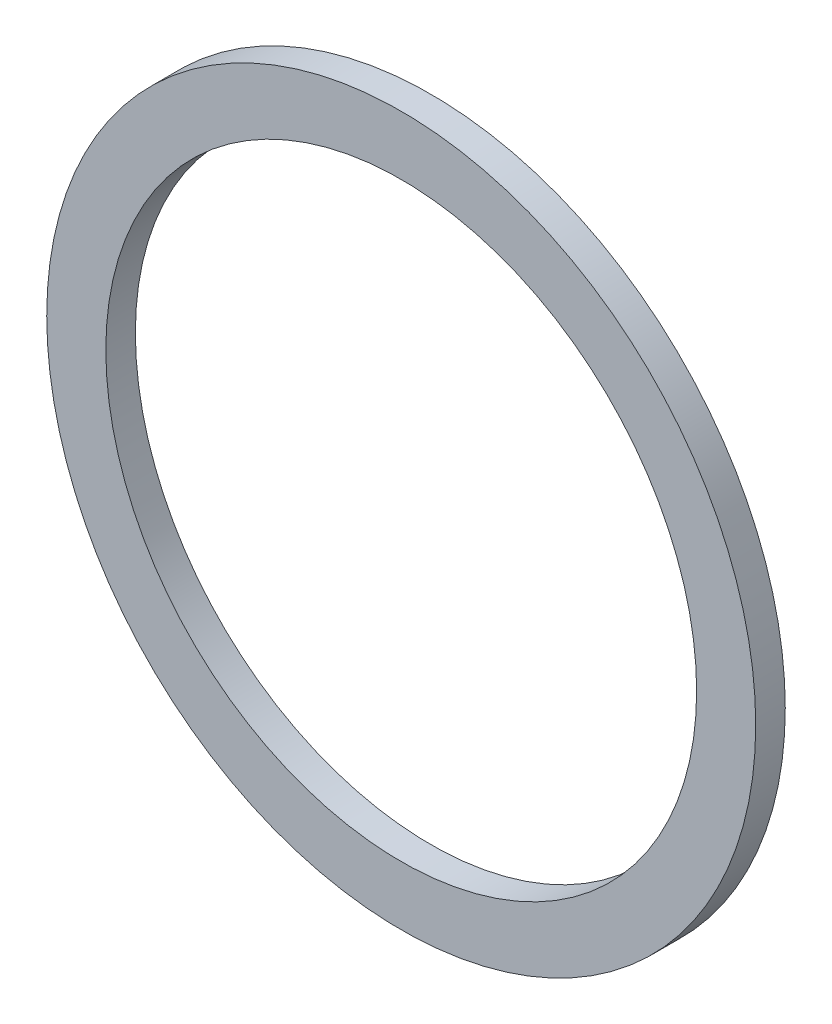
ISO-10303-21;
HEADER;
FILE_DESCRIPTION(('STEP AP214'),'2;1');
FILE_NAME('part.step','',(''),(''),'','','');
FILE_SCHEMA(('AUTOMOTIVE_DESIGN { 1 0 10303 214 1 1 1 1 }'));
ENDSEC;
DATA;
#1=APPLICATION_CONTEXT('core data for automotive mechanical design processes');
#2=APPLICATION_PROTOCOL_DEFINITION('international standard','automotive_design',2000,#1);
#3=PRODUCT_CONTEXT('',#1,'mechanical');
#4=PRODUCT('Part','Part','',(#3));
#5=PRODUCT_RELATED_PRODUCT_CATEGORY('part','',(#4));
#6=PRODUCT_DEFINITION_FORMATION('','',#4);
#7=PRODUCT_DEFINITION_CONTEXT('part definition',#1,'design');
#8=PRODUCT_DEFINITION('design','',#6,#7);
#9=PRODUCT_DEFINITION_SHAPE('','',#8);
#10=(LENGTH_UNIT() NAMED_UNIT(*) SI_UNIT(.MILLI.,.METRE.));
#11=(NAMED_UNIT(*) PLANE_ANGLE_UNIT() SI_UNIT($,.RADIAN.));
#12=(NAMED_UNIT(*) SI_UNIT($,.STERADIAN.) SOLID_ANGLE_UNIT());
#13=UNCERTAINTY_MEASURE_WITH_UNIT(LENGTH_MEASURE(1.E-05),#10,'distance_accuracy_value','');
#14=(GEOMETRIC_REPRESENTATION_CONTEXT(3) GLOBAL_UNCERTAINTY_ASSIGNED_CONTEXT((#13)) GLOBAL_UNIT_ASSIGNED_CONTEXT((#10,
#11,#12)) REPRESENTATION_CONTEXT('',''));
#15=CARTESIAN_POINT('',(0.,0.,0.));
#16=DIRECTION('',(0.,0.,1.));
#17=DIRECTION('',(1.,0.,0.));
#18=AXIS2_PLACEMENT_3D('',#15,#16,#17);
#19=CARTESIAN_POINT('',(0.,0.,1.));
#20=DIRECTION('',(0.,0.,1.));
#21=DIRECTION('',(1.,0.,0.));
#22=AXIS2_PLACEMENT_3D('',#19,#20,#21);
#23=PLANE('',#22);
#24=CARTESIAN_POINT('',(0.,0.,1.));
#25=DIRECTION('',(0.,0.,1.));
#26=DIRECTION('',(1.,0.,0.));
#27=AXIS2_PLACEMENT_3D('',#24,#25,#26);
#28=CIRCLE('',#27,12.);
#29=CARTESIAN_POINT('',(12.,0.,1.));
#30=VERTEX_POINT('',#29);
#31=EDGE_CURVE('E10',#30,#30,#28,.T.);
#32=ORIENTED_EDGE('',*,*,#31,.T.);
#33=EDGE_LOOP('',(#32));
#34=FACE_BOUND('',#33,.T.);
#35=CARTESIAN_POINT('',(0.,0.,1.));
#36=DIRECTION('',(0.,0.,1.));
#37=DIRECTION('',(1.,0.,0.));
#38=AXIS2_PLACEMENT_3D('',#35,#36,#37);
#39=CIRCLE('',#38,10.);
#40=CARTESIAN_POINT('',(10.,0.,1.));
#41=VERTEX_POINT('',#40);
#42=EDGE_CURVE('E50',#41,#41,#39,.T.);
#43=ORIENTED_EDGE('',*,*,#42,.F.);
#44=EDGE_LOOP('',(#43));
#45=FACE_BOUND('',#44,.T.);
#46=ADVANCED_FACE('F37',(#34,#45),#23,.T.);
#47=CARTESIAN_POINT('',(0.,0.,0.));
#48=DIRECTION('',(0.,0.,1.));
#49=DIRECTION('',(1.,0.,0.));
#50=AXIS2_PLACEMENT_3D('',#47,#48,#49);
#51=PLANE('',#50);
#52=CARTESIAN_POINT('',(0.,0.,0.));
#53=DIRECTION('',(0.,0.,1.));
#54=DIRECTION('',(1.,0.,0.));
#55=AXIS2_PLACEMENT_3D('',#52,#53,#54);
#56=CIRCLE('',#55,12.);
#57=CARTESIAN_POINT('',(12.,0.,0.));
#58=VERTEX_POINT('',#57);
#59=EDGE_CURVE('E41',#58,#58,#56,.T.);
#60=ORIENTED_EDGE('',*,*,#59,.F.);
#61=EDGE_LOOP('',(#60));
#62=FACE_BOUND('',#61,.T.);
#63=CARTESIAN_POINT('',(0.,0.,0.));
#64=DIRECTION('',(0.,0.,1.));
#65=DIRECTION('',(1.,0.,0.));
#66=AXIS2_PLACEMENT_3D('',#63,#64,#65);
#67=CIRCLE('',#66,10.);
#68=CARTESIAN_POINT('',(10.,0.,0.));
#69=VERTEX_POINT('',#68);
#70=EDGE_CURVE('E52',#69,#69,#67,.T.);
#71=ORIENTED_EDGE('',*,*,#70,.T.);
#72=EDGE_LOOP('',(#71));
#73=FACE_BOUND('',#72,.T.);
#74=ADVANCED_FACE('F64',(#62,#73),#51,.F.);
#75=CARTESIAN_POINT('',(0.,0.,1.));
#76=DIRECTION('',(0.,0.,-1.));
#77=DIRECTION('',(-1.,0.,0.));
#78=AXIS2_PLACEMENT_3D('',#75,#76,#77);
#79=CYLINDRICAL_SURFACE('',#78,12.);
#80=ORIENTED_EDGE('',*,*,#31,.F.);
#81=EDGE_LOOP('',(#80));
#82=FACE_BOUND('',#81,.T.);
#83=ORIENTED_EDGE('',*,*,#59,.T.);
#84=EDGE_LOOP('',(#83));
#85=FACE_BOUND('',#84,.T.);
#86=ADVANCED_FACE('F39',(#82,#85),#79,.T.);
#87=CARTESIAN_POINT('',(0.,0.,1.));
#88=DIRECTION('',(0.,0.,-1.));
#89=DIRECTION('',(-1.,0.,0.));
#90=AXIS2_PLACEMENT_3D('',#87,#88,#89);
#91=CYLINDRICAL_SURFACE('',#90,10.);
#92=ORIENTED_EDGE('',*,*,#42,.T.);
#93=EDGE_LOOP('',(#92));
#94=FACE_BOUND('',#93,.T.);
#95=ORIENTED_EDGE('',*,*,#70,.F.);
#96=EDGE_LOOP('',(#95));
#97=FACE_BOUND('',#96,.T.);
#98=ADVANCED_FACE('F60',(#94,#97),#91,.F.);
#99=CLOSED_SHELL('',(#46,#74,#86,#98));
#100=MANIFOLD_SOLID_BREP('B2',#99);
#101=ADVANCED_BREP_SHAPE_REPRESENTATION('',(#18,#100),#14);
#102=SHAPE_DEFINITION_REPRESENTATION(#9,#101);
ENDSEC;
END-ISO-10303-21;
